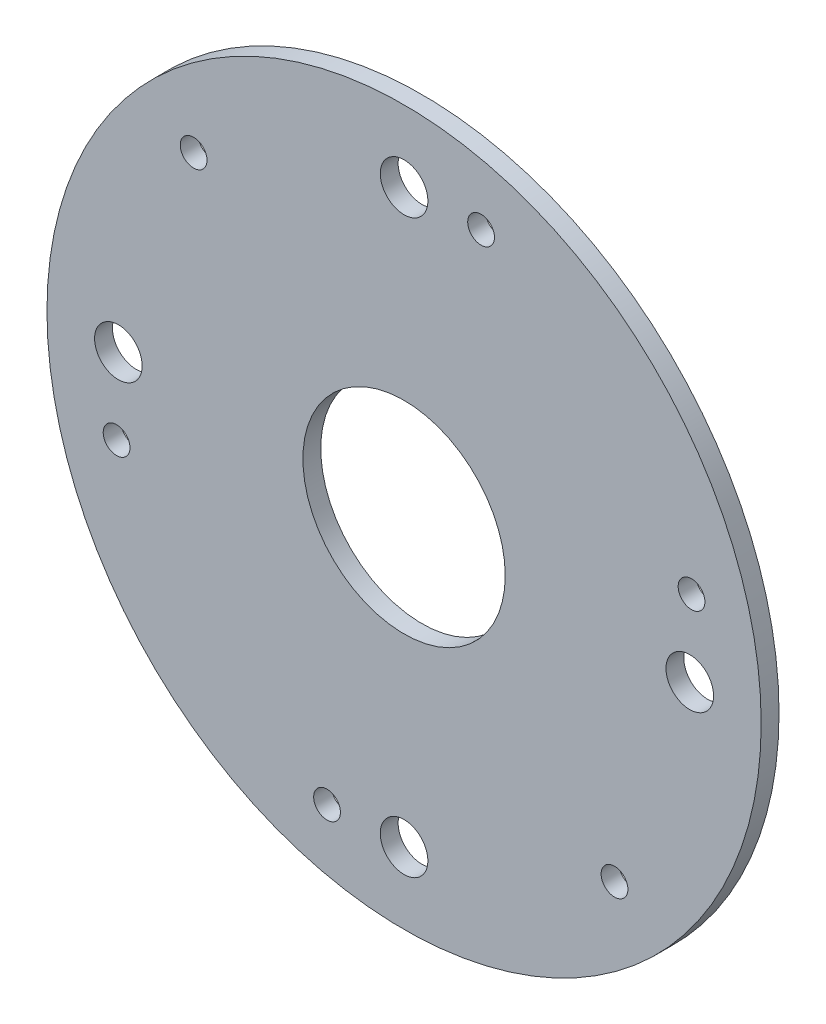
ISO-10303-21;
HEADER;
FILE_DESCRIPTION(('STEP AP214'),'2;1');
FILE_NAME('part.step','',(''),(''),'','','');
FILE_SCHEMA(('AUTOMOTIVE_DESIGN { 1 0 10303 214 1 1 1 1 }'));
ENDSEC;
DATA;
#1=APPLICATION_CONTEXT('core data for automotive mechanical design processes');
#2=APPLICATION_PROTOCOL_DEFINITION('international standard','automotive_design',2000,#1);
#3=PRODUCT_CONTEXT('',#1,'mechanical');
#4=PRODUCT('Part','Part','',(#3));
#5=PRODUCT_RELATED_PRODUCT_CATEGORY('part','',(#4));
#6=PRODUCT_DEFINITION_FORMATION('','',#4);
#7=PRODUCT_DEFINITION_CONTEXT('part definition',#1,'design');
#8=PRODUCT_DEFINITION('design','',#6,#7);
#9=PRODUCT_DEFINITION_SHAPE('','',#8);
#10=(LENGTH_UNIT() NAMED_UNIT(*) SI_UNIT(.MILLI.,.METRE.));
#11=(NAMED_UNIT(*) PLANE_ANGLE_UNIT() SI_UNIT($,.RADIAN.));
#12=(NAMED_UNIT(*) SI_UNIT($,.STERADIAN.) SOLID_ANGLE_UNIT());
#13=UNCERTAINTY_MEASURE_WITH_UNIT(LENGTH_MEASURE(1.E-05),#10,'distance_accuracy_value','');
#14=(GEOMETRIC_REPRESENTATION_CONTEXT(3) GLOBAL_UNCERTAINTY_ASSIGNED_CONTEXT((#13)) GLOBAL_UNIT_ASSIGNED_CONTEXT((#10,
#11,#12)) REPRESENTATION_CONTEXT('',''));
#15=CARTESIAN_POINT('',(0.,0.,0.));
#16=DIRECTION('',(0.,0.,1.));
#17=DIRECTION('',(1.,0.,0.));
#18=AXIS2_PLACEMENT_3D('',#15,#16,#17);
#19=CARTESIAN_POINT('',(0.,0.,58.5));
#20=DIRECTION('',(0.,0.,1.));
#21=DIRECTION('',(1.,0.,0.));
#22=AXIS2_PLACEMENT_3D('',#19,#20,#21);
#23=PLANE('',#22);
#24=CARTESIAN_POINT('',(48.,0.,58.5));
#25=DIRECTION('',(0.,0.,1.));
#26=DIRECTION('',(1.,0.,0.));
#27=AXIS2_PLACEMENT_3D('',#24,#25,#26);
#28=CIRCLE('',#27,4.);
#29=CARTESIAN_POINT('',(52.,0.,58.5));
#30=VERTEX_POINT('',#29);
#31=EDGE_CURVE('E64',#30,#30,#28,.T.);
#32=ORIENTED_EDGE('',*,*,#31,.F.);
#33=EDGE_LOOP('',(#32));
#34=FACE_BOUND('',#33,.T.);
#35=CARTESIAN_POINT('',(0.,48.,58.5));
#36=DIRECTION('',(0.,0.,1.));
#37=DIRECTION('',(1.,0.,0.));
#38=AXIS2_PLACEMENT_3D('',#35,#36,#37);
#39=CIRCLE('',#38,4.);
#40=CARTESIAN_POINT('',(4.,48.,58.5));
#41=VERTEX_POINT('',#40);
#42=EDGE_CURVE('E100',#41,#41,#39,.T.);
#43=ORIENTED_EDGE('',*,*,#42,.F.);
#44=EDGE_LOOP('',(#43));
#45=FACE_BOUND('',#44,.T.);
#46=CARTESIAN_POINT('',(-48.,0.,58.5));
#47=DIRECTION('',(0.,0.,1.));
#48=DIRECTION('',(1.,0.,0.));
#49=AXIS2_PLACEMENT_3D('',#46,#47,#48);
#50=CIRCLE('',#49,4.);
#51=CARTESIAN_POINT('',(-44.,0.,58.5));
#52=VERTEX_POINT('',#51);
#53=EDGE_CURVE('E96',#52,#52,#50,.T.);
#54=ORIENTED_EDGE('',*,*,#53,.F.);
#55=EDGE_LOOP('',(#54));
#56=FACE_BOUND('',#55,.T.);
#57=CARTESIAN_POINT('',(0.,-48.,58.5));
#58=DIRECTION('',(0.,0.,1.));
#59=DIRECTION('',(1.,0.,0.));
#60=AXIS2_PLACEMENT_3D('',#57,#58,#59);
#61=CIRCLE('',#60,4.);
#62=CARTESIAN_POINT('',(3.99999999999999,-48.,58.5));
#63=VERTEX_POINT('',#62);
#64=EDGE_CURVE('E92',#63,#63,#61,.T.);
#65=ORIENTED_EDGE('',*,*,#64,.F.);
#66=EDGE_LOOP('',(#65));
#67=FACE_BOUND('',#66,.T.);
#68=CARTESIAN_POINT('',(-12.9409522551261,-48.2962913144534,58.5));
#69=DIRECTION('',(0.,0.,1.));
#70=DIRECTION('',(1.,0.,0.));
#71=AXIS2_PLACEMENT_3D('',#68,#69,#70);
#72=CIRCLE('',#71,2.25);
#73=CARTESIAN_POINT('',(-10.6909522551261,-48.2962913144534,58.5));
#74=VERTEX_POINT('',#73);
#75=EDGE_CURVE('E87',#74,#74,#72,.T.);
#76=ORIENTED_EDGE('',*,*,#75,.F.);
#77=EDGE_LOOP('',(#76));
#78=FACE_BOUND('',#77,.T.);
#79=CARTESIAN_POINT('',(-48.2962913144534,-12.940952255126,58.5));
#80=DIRECTION('',(0.,0.,1.));
#81=DIRECTION('',(1.,0.,0.));
#82=AXIS2_PLACEMENT_3D('',#79,#80,#81);
#83=CIRCLE('',#82,2.25);
#84=CARTESIAN_POINT('',(-46.0462913144534,-12.940952255126,58.5));
#85=VERTEX_POINT('',#84);
#86=EDGE_CURVE('E82',#85,#85,#83,.T.);
#87=ORIENTED_EDGE('',*,*,#86,.F.);
#88=EDGE_LOOP('',(#87));
#89=FACE_BOUND('',#88,.T.);
#90=CARTESIAN_POINT('',(-35.3553390593274,35.3553390593274,58.5));
#91=DIRECTION('',(0.,0.,1.));
#92=DIRECTION('',(1.,0.,0.));
#93=AXIS2_PLACEMENT_3D('',#90,#91,#92);
#94=CIRCLE('',#93,2.25);
#95=CARTESIAN_POINT('',(-33.1053390593274,35.3553390593274,58.5));
#96=VERTEX_POINT('',#95);
#97=EDGE_CURVE('E77',#96,#96,#94,.T.);
#98=ORIENTED_EDGE('',*,*,#97,.F.);
#99=EDGE_LOOP('',(#98));
#100=FACE_BOUND('',#99,.T.);
#101=CARTESIAN_POINT('',(12.940952255126,48.2962913144534,58.5));
#102=DIRECTION('',(0.,0.,1.));
#103=DIRECTION('',(1.,0.,0.));
#104=AXIS2_PLACEMENT_3D('',#101,#102,#103);
#105=CIRCLE('',#104,2.25);
#106=CARTESIAN_POINT('',(15.190952255126,48.2962913144534,58.5));
#107=VERTEX_POINT('',#106);
#108=EDGE_CURVE('E73',#107,#107,#105,.T.);
#109=ORIENTED_EDGE('',*,*,#108,.F.);
#110=EDGE_LOOP('',(#109));
#111=FACE_BOUND('',#110,.T.);
#112=CARTESIAN_POINT('',(48.2962913144534,12.940952255126,58.5));
#113=DIRECTION('',(0.,0.,1.));
#114=DIRECTION('',(1.,0.,0.));
#115=AXIS2_PLACEMENT_3D('',#112,#113,#114);
#116=CIRCLE('',#115,2.25);
#117=CARTESIAN_POINT('',(50.5462913144534,12.940952255126,58.5));
#118=VERTEX_POINT('',#117);
#119=EDGE_CURVE('E69',#118,#118,#116,.T.);
#120=ORIENTED_EDGE('',*,*,#119,.F.);
#121=EDGE_LOOP('',(#120));
#122=FACE_BOUND('',#121,.T.);
#123=CARTESIAN_POINT('',(35.3553390593274,-35.3553390593274,58.5));
#124=DIRECTION('',(0.,0.,1.));
#125=DIRECTION('',(1.,0.,0.));
#126=AXIS2_PLACEMENT_3D('',#123,#124,#125);
#127=CIRCLE('',#126,2.25);
#128=CARTESIAN_POINT('',(37.6053390593274,-35.3553390593274,58.5));
#129=VERTEX_POINT('',#128);
#130=EDGE_CURVE('E63',#129,#129,#127,.T.);
#131=ORIENTED_EDGE('',*,*,#130,.F.);
#132=EDGE_LOOP('',(#131));
#133=FACE_BOUND('',#132,.T.);
#134=CARTESIAN_POINT('',(0.,0.,58.5));
#135=DIRECTION('',(0.,0.,1.));
#136=DIRECTION('',(1.,0.,0.));
#137=AXIS2_PLACEMENT_3D('',#134,#135,#136);
#138=CIRCLE('',#137,60.);
#139=CARTESIAN_POINT('',(60.,0.,58.5));
#140=VERTEX_POINT('',#139);
#141=EDGE_CURVE('E10',#140,#140,#138,.T.);
#142=ORIENTED_EDGE('',*,*,#141,.T.);
#143=EDGE_LOOP('',(#142));
#144=FACE_BOUND('',#143,.T.);
#145=CARTESIAN_POINT('',(0.,0.,58.5));
#146=DIRECTION('',(0.,0.,1.));
#147=DIRECTION('',(1.,0.,0.));
#148=AXIS2_PLACEMENT_3D('',#145,#146,#147);
#149=CIRCLE('',#148,17.);
#150=CARTESIAN_POINT('',(17.,0.,58.5));
#151=VERTEX_POINT('',#150);
#152=EDGE_CURVE('E53',#151,#151,#149,.T.);
#153=ORIENTED_EDGE('',*,*,#152,.F.);
#154=EDGE_LOOP('',(#153));
#155=FACE_BOUND('',#154,.T.);
#156=ADVANCED_FACE('F36',(#34,#45,#56,#67,#78,#89,#100,#111,#122,#133,#144,#155),#23,.T.);
#157=CARTESIAN_POINT('',(0.,0.,55.5));
#158=DIRECTION('',(0.,0.,1.));
#159=DIRECTION('',(1.,0.,0.));
#160=AXIS2_PLACEMENT_3D('',#157,#158,#159);
#161=PLANE('',#160);
#162=CARTESIAN_POINT('',(48.,0.,55.5));
#163=DIRECTION('',(0.,0.,1.));
#164=DIRECTION('',(1.,0.,0.));
#165=AXIS2_PLACEMENT_3D('',#162,#163,#164);
#166=CIRCLE('',#165,4.);
#167=CARTESIAN_POINT('',(52.,0.,55.5));
#168=VERTEX_POINT('',#167);
#169=EDGE_CURVE('E40',#168,#168,#166,.T.);
#170=ORIENTED_EDGE('',*,*,#169,.T.);
#171=EDGE_LOOP('',(#170));
#172=FACE_BOUND('',#171,.T.);
#173=CARTESIAN_POINT('',(0.,48.,55.5));
#174=DIRECTION('',(0.,0.,1.));
#175=DIRECTION('',(1.,0.,0.));
#176=AXIS2_PLACEMENT_3D('',#173,#174,#175);
#177=CIRCLE('',#176,4.);
#178=CARTESIAN_POINT('',(4.,48.,55.5));
#179=VERTEX_POINT('',#178);
#180=EDGE_CURVE('E97',#179,#179,#177,.T.);
#181=ORIENTED_EDGE('',*,*,#180,.T.);
#182=EDGE_LOOP('',(#181));
#183=FACE_BOUND('',#182,.T.);
#184=CARTESIAN_POINT('',(-48.,0.,55.5));
#185=DIRECTION('',(0.,0.,1.));
#186=DIRECTION('',(1.,0.,0.));
#187=AXIS2_PLACEMENT_3D('',#184,#185,#186);
#188=CIRCLE('',#187,4.);
#189=CARTESIAN_POINT('',(-44.,0.,55.5));
#190=VERTEX_POINT('',#189);
#191=EDGE_CURVE('E93',#190,#190,#188,.T.);
#192=ORIENTED_EDGE('',*,*,#191,.T.);
#193=EDGE_LOOP('',(#192));
#194=FACE_BOUND('',#193,.T.);
#195=CARTESIAN_POINT('',(0.,-48.,55.5));
#196=DIRECTION('',(0.,0.,1.));
#197=DIRECTION('',(1.,0.,0.));
#198=AXIS2_PLACEMENT_3D('',#195,#196,#197);
#199=CIRCLE('',#198,4.);
#200=CARTESIAN_POINT('',(3.99999999999999,-48.,55.5));
#201=VERTEX_POINT('',#200);
#202=EDGE_CURVE('E88',#201,#201,#199,.T.);
#203=ORIENTED_EDGE('',*,*,#202,.T.);
#204=EDGE_LOOP('',(#203));
#205=FACE_BOUND('',#204,.T.);
#206=CARTESIAN_POINT('',(-12.9409522551261,-48.2962913144534,55.5));
#207=DIRECTION('',(0.,0.,1.));
#208=DIRECTION('',(1.,0.,0.));
#209=AXIS2_PLACEMENT_3D('',#206,#207,#208);
#210=CIRCLE('',#209,2.25);
#211=CARTESIAN_POINT('',(-10.6909522551261,-48.2962913144534,55.5));
#212=VERTEX_POINT('',#211);
#213=EDGE_CURVE('E83',#212,#212,#210,.T.);
#214=ORIENTED_EDGE('',*,*,#213,.T.);
#215=EDGE_LOOP('',(#214));
#216=FACE_BOUND('',#215,.T.);
#217=CARTESIAN_POINT('',(-48.2962913144534,-12.940952255126,55.5));
#218=DIRECTION('',(0.,0.,1.));
#219=DIRECTION('',(1.,0.,0.));
#220=AXIS2_PLACEMENT_3D('',#217,#218,#219);
#221=CIRCLE('',#220,2.25);
#222=CARTESIAN_POINT('',(-46.0462913144534,-12.940952255126,55.5));
#223=VERTEX_POINT('',#222);
#224=EDGE_CURVE('E78',#223,#223,#221,.T.);
#225=ORIENTED_EDGE('',*,*,#224,.T.);
#226=EDGE_LOOP('',(#225));
#227=FACE_BOUND('',#226,.T.);
#228=CARTESIAN_POINT('',(-35.3553390593274,35.3553390593274,55.5));
#229=DIRECTION('',(0.,0.,1.));
#230=DIRECTION('',(1.,0.,0.));
#231=AXIS2_PLACEMENT_3D('',#228,#229,#230);
#232=CIRCLE('',#231,2.25);
#233=CARTESIAN_POINT('',(-33.1053390593274,35.3553390593274,55.5));
#234=VERTEX_POINT('',#233);
#235=EDGE_CURVE('E74',#234,#234,#232,.T.);
#236=ORIENTED_EDGE('',*,*,#235,.T.);
#237=EDGE_LOOP('',(#236));
#238=FACE_BOUND('',#237,.T.);
#239=CARTESIAN_POINT('',(12.940952255126,48.2962913144534,55.5));
#240=DIRECTION('',(0.,0.,1.));
#241=DIRECTION('',(1.,0.,0.));
#242=AXIS2_PLACEMENT_3D('',#239,#240,#241);
#243=CIRCLE('',#242,2.25);
#244=CARTESIAN_POINT('',(15.190952255126,48.2962913144534,55.5));
#245=VERTEX_POINT('',#244);
#246=EDGE_CURVE('E70',#245,#245,#243,.T.);
#247=ORIENTED_EDGE('',*,*,#246,.T.);
#248=EDGE_LOOP('',(#247));
#249=FACE_BOUND('',#248,.T.);
#250=CARTESIAN_POINT('',(48.2962913144534,12.940952255126,55.5));
#251=DIRECTION('',(0.,0.,1.));
#252=DIRECTION('',(1.,0.,0.));
#253=AXIS2_PLACEMENT_3D('',#250,#251,#252);
#254=CIRCLE('',#253,2.25);
#255=CARTESIAN_POINT('',(50.5462913144534,12.940952255126,55.5));
#256=VERTEX_POINT('',#255);
#257=EDGE_CURVE('E65',#256,#256,#254,.T.);
#258=ORIENTED_EDGE('',*,*,#257,.T.);
#259=EDGE_LOOP('',(#258));
#260=FACE_BOUND('',#259,.T.);
#261=CARTESIAN_POINT('',(35.3553390593274,-35.3553390593274,55.5));
#262=DIRECTION('',(0.,0.,1.));
#263=DIRECTION('',(1.,0.,0.));
#264=AXIS2_PLACEMENT_3D('',#261,#262,#263);
#265=CIRCLE('',#264,2.25);
#266=CARTESIAN_POINT('',(37.6053390593274,-35.3553390593274,55.5));
#267=VERTEX_POINT('',#266);
#268=EDGE_CURVE('E59',#267,#267,#265,.T.);
#269=ORIENTED_EDGE('',*,*,#268,.T.);
#270=EDGE_LOOP('',(#269));
#271=FACE_BOUND('',#270,.T.);
#272=CARTESIAN_POINT('',(0.,0.,55.5));
#273=DIRECTION('',(0.,0.,1.));
#274=DIRECTION('',(1.,0.,0.));
#275=AXIS2_PLACEMENT_3D('',#272,#273,#274);
#276=CIRCLE('',#275,60.);
#277=CARTESIAN_POINT('',(60.,0.,55.5));
#278=VERTEX_POINT('',#277);
#279=EDGE_CURVE('E45',#278,#278,#276,.T.);
#280=ORIENTED_EDGE('',*,*,#279,.F.);
#281=EDGE_LOOP('',(#280));
#282=FACE_BOUND('',#281,.T.);
#283=CARTESIAN_POINT('',(0.,0.,55.5));
#284=DIRECTION('',(0.,0.,1.));
#285=DIRECTION('',(1.,0.,0.));
#286=AXIS2_PLACEMENT_3D('',#283,#284,#285);
#287=CIRCLE('',#286,17.);
#288=CARTESIAN_POINT('',(17.,0.,55.5));
#289=VERTEX_POINT('',#288);
#290=EDGE_CURVE('E56',#289,#289,#287,.T.);
#291=ORIENTED_EDGE('',*,*,#290,.T.);
#292=EDGE_LOOP('',(#291));
#293=FACE_BOUND('',#292,.T.);
#294=ADVANCED_FACE('F141',(#172,#183,#194,#205,#216,#227,#238,#249,#260,#271,#282,#293),#161,.F.);
#295=CARTESIAN_POINT('',(0.,0.,58.5));
#296=DIRECTION('',(0.,0.,-1.));
#297=DIRECTION('',(-1.,0.,0.));
#298=AXIS2_PLACEMENT_3D('',#295,#296,#297);
#299=CYLINDRICAL_SURFACE('',#298,60.);
#300=ORIENTED_EDGE('',*,*,#141,.F.);
#301=EDGE_LOOP('',(#300));
#302=FACE_BOUND('',#301,.T.);
#303=ORIENTED_EDGE('',*,*,#279,.T.);
#304=EDGE_LOOP('',(#303));
#305=FACE_BOUND('',#304,.T.);
#306=ADVANCED_FACE('F38',(#302,#305),#299,.T.);
#307=CARTESIAN_POINT('',(0.,0.,58.5));
#308=DIRECTION('',(0.,0.,-1.));
#309=DIRECTION('',(-1.,0.,0.));
#310=AXIS2_PLACEMENT_3D('',#307,#308,#309);
#311=CYLINDRICAL_SURFACE('',#310,17.);
#312=ORIENTED_EDGE('',*,*,#152,.T.);
#313=EDGE_LOOP('',(#312));
#314=FACE_BOUND('',#313,.T.);
#315=ORIENTED_EDGE('',*,*,#290,.F.);
#316=EDGE_LOOP('',(#315));
#317=FACE_BOUND('',#316,.T.);
#318=ADVANCED_FACE('F143',(#314,#317),#311,.F.);
#319=CARTESIAN_POINT('',(35.3553390593274,-35.3553390593274,-100.));
#320=DIRECTION('',(0.,0.,1.));
#321=DIRECTION('',(1.,0.,0.));
#322=AXIS2_PLACEMENT_3D('',#319,#320,#321);
#323=CYLINDRICAL_SURFACE('',#322,2.25);
#324=ORIENTED_EDGE('',*,*,#130,.T.);
#325=EDGE_LOOP('',(#324));
#326=FACE_BOUND('',#325,.T.);
#327=ORIENTED_EDGE('',*,*,#268,.F.);
#328=EDGE_LOOP('',(#327));
#329=FACE_BOUND('',#328,.T.);
#330=ADVANCED_FACE('F145',(#326,#329),#323,.F.);
#331=CARTESIAN_POINT('',(48.2962913144534,12.940952255126,-100.));
#332=DIRECTION('',(0.,0.,1.));
#333=DIRECTION('',(1.,0.,0.));
#334=AXIS2_PLACEMENT_3D('',#331,#332,#333);
#335=CYLINDRICAL_SURFACE('',#334,2.25);
#336=ORIENTED_EDGE('',*,*,#119,.T.);
#337=EDGE_LOOP('',(#336));
#338=FACE_BOUND('',#337,.T.);
#339=ORIENTED_EDGE('',*,*,#257,.F.);
#340=EDGE_LOOP('',(#339));
#341=FACE_BOUND('',#340,.T.);
#342=ADVANCED_FACE('F151',(#338,#341),#335,.F.);
#343=CARTESIAN_POINT('',(12.940952255126,48.2962913144534,-100.));
#344=DIRECTION('',(0.,0.,1.));
#345=DIRECTION('',(1.,0.,0.));
#346=AXIS2_PLACEMENT_3D('',#343,#344,#345);
#347=CYLINDRICAL_SURFACE('',#346,2.25);
#348=ORIENTED_EDGE('',*,*,#108,.T.);
#349=EDGE_LOOP('',(#348));
#350=FACE_BOUND('',#349,.T.);
#351=ORIENTED_EDGE('',*,*,#246,.F.);
#352=EDGE_LOOP('',(#351));
#353=FACE_BOUND('',#352,.T.);
#354=ADVANCED_FACE('F192',(#350,#353),#347,.F.);
#355=CARTESIAN_POINT('',(-35.3553390593274,35.3553390593274,-100.));
#356=DIRECTION('',(0.,0.,1.));
#357=DIRECTION('',(1.,0.,0.));
#358=AXIS2_PLACEMENT_3D('',#355,#356,#357);
#359=CYLINDRICAL_SURFACE('',#358,2.25);
#360=ORIENTED_EDGE('',*,*,#97,.T.);
#361=EDGE_LOOP('',(#360));
#362=FACE_BOUND('',#361,.T.);
#363=ORIENTED_EDGE('',*,*,#235,.F.);
#364=EDGE_LOOP('',(#363));
#365=FACE_BOUND('',#364,.T.);
#366=ADVANCED_FACE('F198',(#362,#365),#359,.F.);
#367=CARTESIAN_POINT('',(-48.2962913144534,-12.940952255126,-100.));
#368=DIRECTION('',(0.,0.,1.));
#369=DIRECTION('',(1.,0.,0.));
#370=AXIS2_PLACEMENT_3D('',#367,#368,#369);
#371=CYLINDRICAL_SURFACE('',#370,2.25);
#372=ORIENTED_EDGE('',*,*,#86,.T.);
#373=EDGE_LOOP('',(#372));
#374=FACE_BOUND('',#373,.T.);
#375=ORIENTED_EDGE('',*,*,#224,.F.);
#376=EDGE_LOOP('',(#375));
#377=FACE_BOUND('',#376,.T.);
#378=ADVANCED_FACE('F206',(#374,#377),#371,.F.);
#379=CARTESIAN_POINT('',(-12.9409522551261,-48.2962913144534,-100.));
#380=DIRECTION('',(0.,0.,1.));
#381=DIRECTION('',(1.,0.,0.));
#382=AXIS2_PLACEMENT_3D('',#379,#380,#381);
#383=CYLINDRICAL_SURFACE('',#382,2.25);
#384=ORIENTED_EDGE('',*,*,#75,.T.);
#385=EDGE_LOOP('',(#384));
#386=FACE_BOUND('',#385,.T.);
#387=ORIENTED_EDGE('',*,*,#213,.F.);
#388=EDGE_LOOP('',(#387));
#389=FACE_BOUND('',#388,.T.);
#390=ADVANCED_FACE('F202',(#386,#389),#383,.F.);
#391=CARTESIAN_POINT('',(0.,-48.,-100.));
#392=DIRECTION('',(0.,0.,1.));
#393=DIRECTION('',(1.,0.,0.));
#394=AXIS2_PLACEMENT_3D('',#391,#392,#393);
#395=CYLINDRICAL_SURFACE('',#394,4.);
#396=ORIENTED_EDGE('',*,*,#64,.T.);
#397=EDGE_LOOP('',(#396));
#398=FACE_BOUND('',#397,.T.);
#399=ORIENTED_EDGE('',*,*,#202,.F.);
#400=EDGE_LOOP('',(#399));
#401=FACE_BOUND('',#400,.T.);
#402=ADVANCED_FACE('F205',(#398,#401),#395,.F.);
#403=CARTESIAN_POINT('',(-48.,0.,-100.));
#404=DIRECTION('',(0.,0.,1.));
#405=DIRECTION('',(1.,0.,0.));
#406=AXIS2_PLACEMENT_3D('',#403,#404,#405);
#407=CYLINDRICAL_SURFACE('',#406,4.);
#408=ORIENTED_EDGE('',*,*,#53,.T.);
#409=EDGE_LOOP('',(#408));
#410=FACE_BOUND('',#409,.T.);
#411=ORIENTED_EDGE('',*,*,#191,.F.);
#412=EDGE_LOOP('',(#411));
#413=FACE_BOUND('',#412,.T.);
#414=ADVANCED_FACE('F216',(#410,#413),#407,.F.);
#415=CARTESIAN_POINT('',(0.,48.,-100.));
#416=DIRECTION('',(0.,0.,1.));
#417=DIRECTION('',(1.,0.,0.));
#418=AXIS2_PLACEMENT_3D('',#415,#416,#417);
#419=CYLINDRICAL_SURFACE('',#418,4.);
#420=ORIENTED_EDGE('',*,*,#42,.T.);
#421=EDGE_LOOP('',(#420));
#422=FACE_BOUND('',#421,.T.);
#423=ORIENTED_EDGE('',*,*,#180,.F.);
#424=EDGE_LOOP('',(#423));
#425=FACE_BOUND('',#424,.T.);
#426=ADVANCED_FACE('F220',(#422,#425),#419,.F.);
#427=CARTESIAN_POINT('',(48.,0.,-100.));
#428=DIRECTION('',(0.,0.,1.));
#429=DIRECTION('',(1.,0.,0.));
#430=AXIS2_PLACEMENT_3D('',#427,#428,#429);
#431=CYLINDRICAL_SURFACE('',#430,4.);
#432=ORIENTED_EDGE('',*,*,#31,.T.);
#433=EDGE_LOOP('',(#432));
#434=FACE_BOUND('',#433,.T.);
#435=ORIENTED_EDGE('',*,*,#169,.F.);
#436=EDGE_LOOP('',(#435));
#437=FACE_BOUND('',#436,.T.);
#438=ADVANCED_FACE('F223',(#434,#437),#431,.F.);
#439=CLOSED_SHELL('',(#156,#294,#306,#318,#330,#342,#354,#366,#378,#390,#402,#414,#426,#438));
#440=MANIFOLD_SOLID_BREP('B2',#439);
#441=ADVANCED_BREP_SHAPE_REPRESENTATION('',(#18,#440),#14);
#442=SHAPE_DEFINITION_REPRESENTATION(#9,#441);
ENDSEC;
END-ISO-10303-21;
